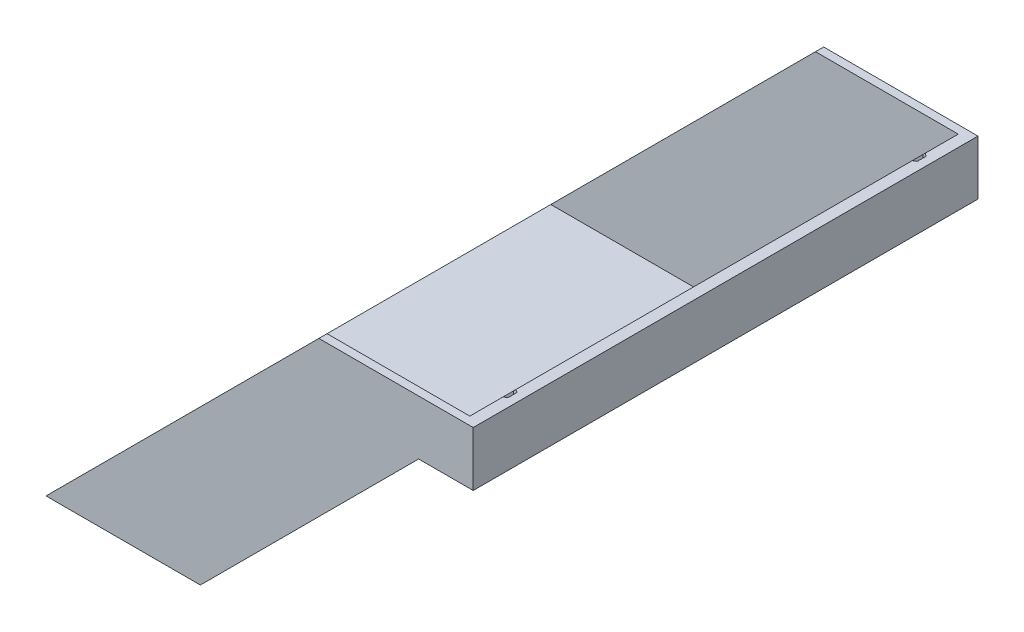
ISO-10303-21;
HEADER;
FILE_DESCRIPTION(('STEP AP214'),'2;1');
FILE_NAME('part.step','',(''),(''),'','','');
FILE_SCHEMA(('AUTOMOTIVE_DESIGN { 1 0 10303 214 1 1 1 1 }'));
ENDSEC;
DATA;
#1=APPLICATION_CONTEXT('core data for automotive mechanical design processes');
#2=APPLICATION_PROTOCOL_DEFINITION('international standard','automotive_design',2000,#1);
#3=PRODUCT_CONTEXT('',#1,'mechanical');
#4=PRODUCT('Part','Part','',(#3));
#5=PRODUCT_RELATED_PRODUCT_CATEGORY('part','',(#4));
#6=PRODUCT_DEFINITION_FORMATION('','',#4);
#7=PRODUCT_DEFINITION_CONTEXT('part definition',#1,'design');
#8=PRODUCT_DEFINITION('design','',#6,#7);
#9=PRODUCT_DEFINITION_SHAPE('','',#8);
#10=(LENGTH_UNIT() NAMED_UNIT(*) SI_UNIT(.MILLI.,.METRE.));
#11=(NAMED_UNIT(*) PLANE_ANGLE_UNIT() SI_UNIT($,.RADIAN.));
#12=(NAMED_UNIT(*) SI_UNIT($,.STERADIAN.) SOLID_ANGLE_UNIT());
#13=UNCERTAINTY_MEASURE_WITH_UNIT(LENGTH_MEASURE(1.E-05),#10,'distance_accuracy_value','');
#14=(GEOMETRIC_REPRESENTATION_CONTEXT(3) GLOBAL_UNCERTAINTY_ASSIGNED_CONTEXT((#13)) GLOBAL_UNIT_ASSIGNED_CONTEXT((#10,
#11,#12)) REPRESENTATION_CONTEXT('',''));
#15=CARTESIAN_POINT('',(0.,0.,0.));
#16=DIRECTION('',(0.,0.,1.));
#17=DIRECTION('',(1.,0.,0.));
#18=AXIS2_PLACEMENT_3D('',#15,#16,#17);
#19=CARTESIAN_POINT('',(-5.99999999999999,0.001000000000001,17.5));
#20=DIRECTION('',(0.,-1.,0.));
#21=DIRECTION('',(1.,0.,0.));
#22=AXIS2_PLACEMENT_3D('',#19,#20,#21);
#23=CYLINDRICAL_SURFACE('',#22,1.5);
#24=CARTESIAN_POINT('',(-6.,-20.,17.5));
#25=DIRECTION('',(0.,-1.,0.));
#26=DIRECTION('',(1.,0.,0.));
#27=AXIS2_PLACEMENT_3D('',#24,#25,#26);
#28=CIRCLE('',#27,1.5);
#29=CARTESIAN_POINT('',(-4.5,-20.,17.5));
#30=VERTEX_POINT('',#29);
#31=EDGE_CURVE('E297',#30,#30,#28,.T.);
#32=ORIENTED_EDGE('',*,*,#31,.T.);
#33=EDGE_LOOP('',(#32));
#34=FACE_BOUND('',#33,.T.);
#35=CARTESIAN_POINT('',(-5.99999999999999,-5.,17.5));
#36=DIRECTION('',(0.,1.,0.));
#37=DIRECTION('',(-1.,0.,0.));
#38=AXIS2_PLACEMENT_3D('',#35,#36,#37);
#39=CIRCLE('',#38,1.5);
#40=CARTESIAN_POINT('',(-7.49999999999999,-5.,17.5));
#41=VERTEX_POINT('',#40);
#42=EDGE_CURVE('E300',#41,#41,#39,.F.);
#43=ORIENTED_EDGE('',*,*,#42,.F.);
#44=EDGE_LOOP('',(#43));
#45=FACE_BOUND('',#44,.T.);
#46=ADVANCED_FACE('F39',(#34,#45),#23,.F.);
#47=CARTESIAN_POINT('',(-5.99999999999999,0.001000000000001,167.5));
#48=DIRECTION('',(0.,-1.,0.));
#49=DIRECTION('',(1.,0.,0.));
#50=AXIS2_PLACEMENT_3D('',#47,#48,#49);
#51=CYLINDRICAL_SURFACE('',#50,1.5);
#52=CARTESIAN_POINT('',(-5.99999999999999,-20.,167.5));
#53=DIRECTION('',(0.,-1.,0.));
#54=DIRECTION('',(1.,0.,0.));
#55=AXIS2_PLACEMENT_3D('',#52,#53,#54);
#56=CIRCLE('',#55,1.5);
#57=CARTESIAN_POINT('',(-4.49999999999999,-20.,167.5));
#58=VERTEX_POINT('',#57);
#59=EDGE_CURVE('E293',#58,#58,#56,.T.);
#60=ORIENTED_EDGE('',*,*,#59,.T.);
#61=EDGE_LOOP('',(#60));
#62=FACE_BOUND('',#61,.T.);
#63=CARTESIAN_POINT('',(-5.99999999999999,-5.,167.5));
#64=DIRECTION('',(0.,1.,0.));
#65=DIRECTION('',(-1.,0.,0.));
#66=AXIS2_PLACEMENT_3D('',#63,#64,#65);
#67=CIRCLE('',#66,1.5);
#68=CARTESIAN_POINT('',(-7.49999999999999,-5.,167.5));
#69=VERTEX_POINT('',#68);
#70=EDGE_CURVE('E242',#69,#69,#67,.F.);
#71=ORIENTED_EDGE('',*,*,#70,.F.);
#72=EDGE_LOOP('',(#71));
#73=FACE_BOUND('',#72,.T.);
#74=ADVANCED_FACE('F488',(#62,#73),#51,.F.);
#75=CARTESIAN_POINT('',(0.,0.,185.));
#76=DIRECTION('',(0.,-1.,0.));
#77=DIRECTION('',(1.,0.,0.));
#78=AXIS2_PLACEMENT_3D('',#75,#76,#77);
#79=PLANE('',#78);
#80=DIRECTION('',(0.,0.,-1.));
#81=VECTOR('',#80,1.);
#82=CARTESIAN_POINT('',(-3.09999999999999,0.,19.1743157806499));
#83=LINE('',#82,#81);
#84=CARTESIAN_POINT('',(-3.09999999999999,0.,19.1743157806499));
#85=VERTEX_POINT('',#84);
#86=CARTESIAN_POINT('',(-3.09999999999999,0.,15.8256842193501));
#87=VERTEX_POINT('',#86);
#88=EDGE_CURVE('E227',#85,#87,#83,.T.);
#89=ORIENTED_EDGE('',*,*,#88,.F.);
#90=DIRECTION('',(0.866025403784438,0.,-0.5));
#91=VECTOR('',#90,1.);
#92=CARTESIAN_POINT('',(-6.,0.,20.8486315612998));
#93=LINE('',#92,#91);
#94=CARTESIAN_POINT('',(-4.24264068711931,0.,19.8340196889453));
#95=VERTEX_POINT('',#94);
#96=EDGE_CURVE('E207',#95,#85,#93,.T.);
#97=ORIENTED_EDGE('',*,*,#96,.F.);
#98=DIRECTION('',(0.,0.,-1.));
#99=VECTOR('',#98,1.);
#100=CARTESIAN_POINT('',(-4.24264068711931,0.,185.));
#101=LINE('',#100,#99);
#102=CARTESIAN_POINT('',(-4.24264068711931,0.,165.165980311055));
#103=VERTEX_POINT('',#102);
#104=EDGE_CURVE('E343',#103,#95,#101,.T.);
#105=ORIENTED_EDGE('',*,*,#104,.F.);
#106=DIRECTION('',(-0.866025403784437,0.,-0.500000000000002));
#107=VECTOR('',#106,1.);
#108=CARTESIAN_POINT('',(-3.09999999999999,0.,165.82568421935));
#109=LINE('',#108,#107);
#110=CARTESIAN_POINT('',(-3.09999999999999,0.,165.82568421935));
#111=VERTEX_POINT('',#110);
#112=EDGE_CURVE('E62',#111,#103,#109,.T.);
#113=ORIENTED_EDGE('',*,*,#112,.F.);
#114=DIRECTION('',(0.,0.,-1.));
#115=VECTOR('',#114,1.);
#116=CARTESIAN_POINT('',(-3.09999999999999,0.,169.17431578065));
#117=LINE('',#116,#115);
#118=CARTESIAN_POINT('',(-3.09999999999999,0.,169.17431578065));
#119=VERTEX_POINT('',#118);
#120=EDGE_CURVE('E272',#119,#111,#117,.T.);
#121=ORIENTED_EDGE('',*,*,#120,.F.);
#122=DIRECTION('',(0.866025403784437,0.,-0.500000000000002));
#123=VECTOR('',#122,1.);
#124=CARTESIAN_POINT('',(-6.00000000000002,0.,170.8486315613));
#125=LINE('',#124,#123);
#126=CARTESIAN_POINT('',(-4.24264068711931,0.,169.834019688945));
#127=VERTEX_POINT('',#126);
#128=EDGE_CURVE('E238',#127,#119,#125,.T.);
#129=ORIENTED_EDGE('',*,*,#128,.F.);
#130=CARTESIAN_POINT('',(-4.24264068711931,0.,182.));
#131=VERTEX_POINT('',#130);
#132=EDGE_CURVE('E324',#131,#127,#101,.T.);
#133=ORIENTED_EDGE('',*,*,#132,.F.);
#134=DIRECTION('',(-1.,0.,0.));
#135=VECTOR('',#134,1.);
#136=CARTESIAN_POINT('',(0.,0.,182.));
#137=LINE('',#136,#135);
#138=CARTESIAN_POINT('',(-56.5685424949241,0.,182.));
#139=VERTEX_POINT('',#138);
#140=EDGE_CURVE('E331',#131,#139,#137,.T.);
#141=ORIENTED_EDGE('',*,*,#140,.T.);
#142=DIRECTION('',(0.,0.,-1.));
#143=VECTOR('',#142,1.);
#144=CARTESIAN_POINT('',(-56.5685424949241,0.,185.));
#145=LINE('',#144,#143);
#146=CARTESIAN_POINT('',(-56.5685424949241,0.,185.));
#147=VERTEX_POINT('',#146);
#148=EDGE_CURVE('E374',#147,#139,#145,.T.);
#149=ORIENTED_EDGE('',*,*,#148,.F.);
#150=DIRECTION('',(-1.,0.,0.));
#151=VECTOR('',#150,1.);
#152=CARTESIAN_POINT('',(0.,0.,185.));
#153=LINE('',#152,#151);
#154=CARTESIAN_POINT('',(0.,0.,185.));
#155=VERTEX_POINT('',#154);
#156=EDGE_CURVE('E346',#155,#147,#153,.T.);
#157=ORIENTED_EDGE('',*,*,#156,.F.);
#158=DIRECTION('',(0.,0.,-1.));
#159=VECTOR('',#158,1.);
#160=CARTESIAN_POINT('',(0.,0.,185.));
#161=LINE('',#160,#159);
#162=CARTESIAN_POINT('',(0.,0.,0.));
#163=VERTEX_POINT('',#162);
#164=EDGE_CURVE('E357',#155,#163,#161,.T.);
#165=ORIENTED_EDGE('',*,*,#164,.T.);
#166=DIRECTION('',(-1.,0.,0.));
#167=VECTOR('',#166,1.);
#168=CARTESIAN_POINT('',(0.,0.,0.));
#169=LINE('',#168,#167);
#170=CARTESIAN_POINT('',(-56.5685424949241,0.,0.));
#171=VERTEX_POINT('',#170);
#172=EDGE_CURVE('E336',#163,#171,#169,.T.);
#173=ORIENTED_EDGE('',*,*,#172,.T.);
#174=CARTESIAN_POINT('',(-56.5685424949241,0.,3.));
#175=VERTEX_POINT('',#174);
#176=EDGE_CURVE('E373',#175,#171,#145,.T.);
#177=ORIENTED_EDGE('',*,*,#176,.F.);
#178=DIRECTION('',(-1.,0.,0.));
#179=VECTOR('',#178,1.);
#180=CARTESIAN_POINT('',(0.,0.,3.));
#181=LINE('',#180,#179);
#182=CARTESIAN_POINT('',(-4.24264068711931,0.,3.));
#183=VERTEX_POINT('',#182);
#184=EDGE_CURVE('E315',#183,#175,#181,.T.);
#185=ORIENTED_EDGE('',*,*,#184,.F.);
#186=CARTESIAN_POINT('',(-4.24264068711931,0.,15.1659803110547));
#187=VERTEX_POINT('',#186);
#188=EDGE_CURVE('E333',#187,#183,#101,.T.);
#189=ORIENTED_EDGE('',*,*,#188,.F.);
#190=DIRECTION('',(-0.866025403784439,0.,-0.5));
#191=VECTOR('',#190,1.);
#192=CARTESIAN_POINT('',(-3.09999999999999,0.,15.8256842193501));
#193=LINE('',#192,#191);
#194=EDGE_CURVE('E54',#87,#187,#193,.T.);
#195=ORIENTED_EDGE('',*,*,#194,.F.);
#196=EDGE_LOOP('',(#89,#97,#105,#113,#121,#129,#133,#141,#149,#157,#165,#173,#177,#185,#189,#195));
#197=FACE_BOUND('',#196,.T.);
#198=ADVANCED_FACE('F41',(#197),#79,.F.);
#199=CARTESIAN_POINT('',(-56.5685424949241,0.,185.));
#200=DIRECTION('',(0.707106781186544,-0.707106781186551,0.));
#201=DIRECTION('',(0.707106781186551,0.707106781186544,0.));
#202=AXIS2_PLACEMENT_3D('',#199,#200,#201);
#203=PLANE('',#202);
#204=DIRECTION('',(-0.707106781186551,-0.707106781186544,0.));
#205=VECTOR('',#204,1.);
#206=CARTESIAN_POINT('',(-56.5685424949241,0.,3.));
#207=LINE('',#206,#205);
#208=CARTESIAN_POINT('',(-153.568542494925,-97.,3.));
#209=VERTEX_POINT('',#208);
#210=EDGE_CURVE('E319',#175,#209,#207,.T.);
#211=ORIENTED_EDGE('',*,*,#210,.F.);
#212=ORIENTED_EDGE('',*,*,#176,.T.);
#213=DIRECTION('',(-0.707106781186551,-0.707106781186544,0.));
#214=VECTOR('',#213,1.);
#215=CARTESIAN_POINT('',(-56.5685424949241,0.,0.));
#216=LINE('',#215,#214);
#217=CARTESIAN_POINT('',(-156.568542494925,-100.,0.));
#218=VERTEX_POINT('',#217);
#219=EDGE_CURVE('E360',#171,#218,#216,.T.);
#220=ORIENTED_EDGE('',*,*,#219,.T.);
#221=DIRECTION('',(0.,0.,-1.));
#222=VECTOR('',#221,1.);
#223=CARTESIAN_POINT('',(-156.568542494925,-100.,185.));
#224=LINE('',#223,#222);
#225=CARTESIAN_POINT('',(-156.568542494925,-100.,185.));
#226=VERTEX_POINT('',#225);
#227=EDGE_CURVE('E370',#226,#218,#224,.T.);
#228=ORIENTED_EDGE('',*,*,#227,.F.);
#229=DIRECTION('',(-0.707106781186551,-0.707106781186544,0.));
#230=VECTOR('',#229,1.);
#231=CARTESIAN_POINT('',(-56.5685424949241,0.,185.));
#232=LINE('',#231,#230);
#233=EDGE_CURVE('E349',#147,#226,#232,.T.);
#234=ORIENTED_EDGE('',*,*,#233,.F.);
#235=ORIENTED_EDGE('',*,*,#148,.T.);
#236=DIRECTION('',(-0.707106781186551,-0.707106781186544,0.));
#237=VECTOR('',#236,1.);
#238=CARTESIAN_POINT('',(-56.5685424949241,0.,182.));
#239=LINE('',#238,#237);
#240=CARTESIAN_POINT('',(-153.568542494925,-97.,182.));
#241=VERTEX_POINT('',#240);
#242=EDGE_CURVE('E328',#139,#241,#239,.T.);
#243=ORIENTED_EDGE('',*,*,#242,.T.);
#244=DIRECTION('',(0.,0.,-1.));
#245=VECTOR('',#244,1.);
#246=CARTESIAN_POINT('',(-153.568542494925,-97.,185.));
#247=LINE('',#246,#245);
#248=EDGE_CURVE('E323',#241,#209,#247,.T.);
#249=ORIENTED_EDGE('',*,*,#248,.T.);
#250=EDGE_LOOP('',(#211,#212,#220,#228,#234,#235,#243,#249));
#251=FACE_BOUND('',#250,.T.);
#252=ADVANCED_FACE('F419',(#251),#203,.F.);
#253=CARTESIAN_POINT('',(-156.568542494925,-100.,185.));
#254=DIRECTION('',(0.,1.,0.));
#255=DIRECTION('',(-1.,0.,0.));
#256=AXIS2_PLACEMENT_3D('',#253,#254,#255);
#257=PLANE('',#256);
#258=DIRECTION('',(1.,0.,0.));
#259=VECTOR('',#258,1.);
#260=CARTESIAN_POINT('',(-156.568542494925,-100.,0.));
#261=LINE('',#260,#259);
#262=CARTESIAN_POINT('',(-100.000000000001,-100.,0.));
#263=VERTEX_POINT('',#262);
#264=EDGE_CURVE('E362',#218,#263,#261,.T.);
#265=ORIENTED_EDGE('',*,*,#264,.T.);
#266=DIRECTION('',(0.,0.,-1.));
#267=VECTOR('',#266,1.);
#268=CARTESIAN_POINT('',(-100.000000000001,-100.,185.));
#269=LINE('',#268,#267);
#270=CARTESIAN_POINT('',(-100.000000000001,-100.,185.));
#271=VERTEX_POINT('',#270);
#272=EDGE_CURVE('E367',#271,#263,#269,.T.);
#273=ORIENTED_EDGE('',*,*,#272,.F.);
#274=DIRECTION('',(1.,0.,0.));
#275=VECTOR('',#274,1.);
#276=CARTESIAN_POINT('',(-156.568542494925,-100.,185.));
#277=LINE('',#276,#275);
#278=EDGE_CURVE('E352',#226,#271,#277,.T.);
#279=ORIENTED_EDGE('',*,*,#278,.F.);
#280=ORIENTED_EDGE('',*,*,#227,.T.);
#281=EDGE_LOOP('',(#265,#273,#279,#280));
#282=FACE_BOUND('',#281,.T.);
#283=ADVANCED_FACE('F427',(#282),#257,.F.);
#284=CARTESIAN_POINT('',(0.,0.,185.));
#285=DIRECTION('',(-0.707106781186544,0.707106781186551,0.));
#286=DIRECTION('',(-0.707106781186551,-0.707106781186544,0.));
#287=AXIS2_PLACEMENT_3D('',#284,#285,#286);
#288=PLANE('',#287);
#289=DIRECTION('',(0.707106781186551,0.707106781186544,0.));
#290=VECTOR('',#289,1.);
#291=CARTESIAN_POINT('',(0.,0.,0.));
#292=LINE('',#291,#290);
#293=CARTESIAN_POINT('',(-20.0000000000002,-20.,0.));
#294=VERTEX_POINT('',#293);
#295=EDGE_CURVE('E350',#263,#294,#292,.T.);
#296=ORIENTED_EDGE('',*,*,#295,.T.);
#297=DIRECTION('',(0.,0.,1.));
#298=VECTOR('',#297,1.);
#299=CARTESIAN_POINT('',(-20.000000000001,-20.,-28.2842712474626));
#300=LINE('',#299,#298);
#301=CARTESIAN_POINT('',(-20.0000000000002,-20.,185.));
#302=VERTEX_POINT('',#301);
#303=EDGE_CURVE('E310',#294,#302,#300,.T.);
#304=ORIENTED_EDGE('',*,*,#303,.T.);
#305=DIRECTION('',(0.707106781186551,0.707106781186544,0.));
#306=VECTOR('',#305,1.);
#307=CARTESIAN_POINT('',(0.,0.,185.));
#308=LINE('',#307,#306);
#309=EDGE_CURVE('E354',#271,#302,#308,.T.);
#310=ORIENTED_EDGE('',*,*,#309,.F.);
#311=ORIENTED_EDGE('',*,*,#272,.T.);
#312=EDGE_LOOP('',(#296,#304,#310,#311));
#313=FACE_BOUND('',#312,.T.);
#314=ADVANCED_FACE('F431',(#313),#288,.F.);
#315=CARTESIAN_POINT('',(0.,0.,185.));
#316=DIRECTION('',(0.,0.,1.));
#317=DIRECTION('',(1.,0.,0.));
#318=AXIS2_PLACEMENT_3D('',#315,#316,#317);
#319=PLANE('',#318);
#320=ORIENTED_EDGE('',*,*,#156,.T.);
#321=ORIENTED_EDGE('',*,*,#233,.T.);
#322=ORIENTED_EDGE('',*,*,#278,.T.);
#323=ORIENTED_EDGE('',*,*,#309,.T.);
#324=DIRECTION('',(1.,0.,0.));
#325=VECTOR('',#324,1.);
#326=CARTESIAN_POINT('',(0.,-20.,185.));
#327=LINE('',#326,#325);
#328=CARTESIAN_POINT('',(0.,-20.,185.));
#329=VERTEX_POINT('',#328);
#330=EDGE_CURVE('E296',#302,#329,#327,.T.);
#331=ORIENTED_EDGE('',*,*,#330,.T.);
#332=DIRECTION('',(0.,1.,0.));
#333=VECTOR('',#332,1.);
#334=CARTESIAN_POINT('',(0.,0.,185.));
#335=LINE('',#334,#333);
#336=EDGE_CURVE('E307',#329,#155,#335,.T.);
#337=ORIENTED_EDGE('',*,*,#336,.T.);
#338=EDGE_LOOP('',(#320,#321,#322,#323,#331,#337));
#339=FACE_BOUND('',#338,.T.);
#340=ADVANCED_FACE('F435',(#339),#319,.T.);
#341=CARTESIAN_POINT('',(0.,0.,0.));
#342=DIRECTION('',(0.,0.,1.));
#343=DIRECTION('',(1.,0.,0.));
#344=AXIS2_PLACEMENT_3D('',#341,#342,#343);
#345=PLANE('',#344);
#346=ORIENTED_EDGE('',*,*,#172,.F.);
#347=DIRECTION('',(0.,-1.,0.));
#348=VECTOR('',#347,1.);
#349=CARTESIAN_POINT('',(0.,0.,0.));
#350=LINE('',#349,#348);
#351=CARTESIAN_POINT('',(0.,-20.,0.));
#352=VERTEX_POINT('',#351);
#353=EDGE_CURVE('E301',#163,#352,#350,.T.);
#354=ORIENTED_EDGE('',*,*,#353,.T.);
#355=DIRECTION('',(-1.,0.,0.));
#356=VECTOR('',#355,1.);
#357=CARTESIAN_POINT('',(0.,-20.,0.));
#358=LINE('',#357,#356);
#359=EDGE_CURVE('E303',#352,#294,#358,.T.);
#360=ORIENTED_EDGE('',*,*,#359,.T.);
#361=ORIENTED_EDGE('',*,*,#295,.F.);
#362=ORIENTED_EDGE('',*,*,#264,.F.);
#363=ORIENTED_EDGE('',*,*,#219,.F.);
#364=EDGE_LOOP('',(#346,#354,#360,#361,#362,#363));
#365=FACE_BOUND('',#364,.T.);
#366=ADVANCED_FACE('F423',(#365),#345,.F.);
#367=CARTESIAN_POINT('',(-156.568542494925,-97.,185.));
#368=DIRECTION('',(0.,1.,0.));
#369=DIRECTION('',(-1.,0.,0.));
#370=AXIS2_PLACEMENT_3D('',#367,#368,#369);
#371=PLANE('',#370);
#372=DIRECTION('',(1.,0.,0.));
#373=VECTOR('',#372,1.);
#374=CARTESIAN_POINT('',(-156.568542494925,-97.,3.));
#375=LINE('',#374,#373);
#376=CARTESIAN_POINT('',(-101.24264068712,-97.,3.));
#377=VERTEX_POINT('',#376);
#378=EDGE_CURVE('E316',#209,#377,#375,.T.);
#379=ORIENTED_EDGE('',*,*,#378,.F.);
#380=ORIENTED_EDGE('',*,*,#248,.F.);
#381=DIRECTION('',(1.,0.,0.));
#382=VECTOR('',#381,1.);
#383=CARTESIAN_POINT('',(-156.568542494925,-97.,182.));
#384=LINE('',#383,#382);
#385=CARTESIAN_POINT('',(-101.24264068712,-97.,182.));
#386=VERTEX_POINT('',#385);
#387=EDGE_CURVE('E325',#241,#386,#384,.T.);
#388=ORIENTED_EDGE('',*,*,#387,.T.);
#389=DIRECTION('',(0.,0.,-1.));
#390=VECTOR('',#389,1.);
#391=CARTESIAN_POINT('',(-101.24264068712,-97.,185.));
#392=LINE('',#391,#390);
#393=EDGE_CURVE('E320',#386,#377,#392,.T.);
#394=ORIENTED_EDGE('',*,*,#393,.T.);
#395=EDGE_LOOP('',(#379,#380,#388,#394));
#396=FACE_BOUND('',#395,.T.);
#397=ADVANCED_FACE('F453',(#396),#371,.T.);
#398=CARTESIAN_POINT('',(-2.12132034355963,2.12132034355965,185.));
#399=DIRECTION('',(-0.707106781186544,0.707106781186551,0.));
#400=DIRECTION('',(-0.707106781186551,-0.707106781186544,0.));
#401=AXIS2_PLACEMENT_3D('',#398,#399,#400);
#402=PLANE('',#401);
#403=DIRECTION('',(0.65465367070798,0.654653670707973,-0.377964473009229));
#404=VECTOR('',#403,1.);
#405=CARTESIAN_POINT('',(-43.2923474755925,-39.0497067884728,42.3793784150463));
#406=LINE('',#405,#404);
#407=CARTESIAN_POINT('',(-5.99999999999998,-1.75735931288063,20.8486315612998));
#408=VERTEX_POINT('',#407);
#409=EDGE_CURVE('E11',#408,#95,#406,.T.);
#410=ORIENTED_EDGE('',*,*,#409,.F.);
#411=DIRECTION('',(0.65465367070798,0.654653670707973,0.377964473009229));
#412=VECTOR('',#411,1.);
#413=CARTESIAN_POINT('',(37.9415126009188,42.1841532880377,46.2182756900397));
#414=LINE('',#413,#412);
#415=CARTESIAN_POINT('',(-8.89999999999999,-4.65735931288064,19.1743157806499));
#416=VERTEX_POINT('',#415);
#417=EDGE_CURVE('E47',#416,#408,#414,.T.);
#418=ORIENTED_EDGE('',*,*,#417,.F.);
#419=DIRECTION('',(0.,0.,1.));
#420=VECTOR('',#419,1.);
#421=CARTESIAN_POINT('',(-8.89999999999999,-4.65735931288064,185.));
#422=LINE('',#421,#420);
#423=CARTESIAN_POINT('',(-8.89999999999998,-4.65735931288063,15.8256842193501));
#424=VERTEX_POINT('',#423);
#425=EDGE_CURVE('E395',#424,#416,#422,.T.);
#426=ORIENTED_EDGE('',*,*,#425,.F.);
#427=DIRECTION('',(-0.65465367070798,-0.654653670707973,0.377964473009229));
#428=VECTOR('',#427,1.);
#429=CARTESIAN_POINT('',(-44.9494903327353,-40.7068496456156,36.6388671671037));
#430=LINE('',#429,#428);
#431=CARTESIAN_POINT('',(-6.00000000000001,-1.7573593128807,14.1513684387002));
#432=VERTEX_POINT('',#431);
#433=EDGE_CURVE('E393',#432,#424,#430,.T.);
#434=ORIENTED_EDGE('',*,*,#433,.F.);
#435=DIRECTION('',(-0.65465367070798,-0.654653670707973,-0.377964473009229));
#436=VECTOR('',#435,1.);
#437=CARTESIAN_POINT('',(39.5986554580617,43.8412961451805,40.4777644420971));
#438=LINE('',#437,#436);
#439=EDGE_CURVE('E391',#187,#432,#438,.T.);
#440=ORIENTED_EDGE('',*,*,#439,.F.);
#441=ORIENTED_EDGE('',*,*,#188,.T.);
#442=DIRECTION('',(0.707106781186551,0.707106781186544,0.));
#443=VECTOR('',#442,1.);
#444=CARTESIAN_POINT('',(-2.12132034355963,2.12132034355965,3.));
#445=LINE('',#444,#443);
#446=EDGE_CURVE('E318',#377,#183,#445,.T.);
#447=ORIENTED_EDGE('',*,*,#446,.F.);
#448=ORIENTED_EDGE('',*,*,#393,.F.);
#449=DIRECTION('',(0.707106781186551,0.707106781186544,0.));
#450=VECTOR('',#449,1.);
#451=CARTESIAN_POINT('',(-2.12132034355963,2.12132034355965,182.));
#452=LINE('',#451,#450);
#453=EDGE_CURVE('E327',#386,#131,#452,.T.);
#454=ORIENTED_EDGE('',*,*,#453,.T.);
#455=ORIENTED_EDGE('',*,*,#132,.T.);
#456=DIRECTION('',(0.65465367070798,0.654653670707973,-0.377964473009231));
#457=VECTOR('',#456,1.);
#458=CARTESIAN_POINT('',(-6.17697302768765,-1.93433234056832,170.950806986475));
#459=LINE('',#458,#457);
#460=CARTESIAN_POINT('',(-6.00000000000002,-1.7573593128807,170.8486315613));
#461=VERTEX_POINT('',#460);
#462=EDGE_CURVE('E389',#461,#127,#459,.T.);
#463=ORIENTED_EDGE('',*,*,#462,.F.);
#464=DIRECTION('',(0.654653670707981,0.654653670707975,0.377964473009224));
#465=VECTOR('',#464,1.);
#466=CARTESIAN_POINT('',(0.826138153013941,5.0687788401332,174.789704261468));
#467=LINE('',#466,#465);
#468=CARTESIAN_POINT('',(-8.90000000000002,-4.65735931288066,169.17431578065));
#469=VERTEX_POINT('',#468);
#470=EDGE_CURVE('E387',#469,#461,#467,.T.);
#471=ORIENTED_EDGE('',*,*,#470,.F.);
#472=DIRECTION('',(0.,0.,1.));
#473=VECTOR('',#472,1.);
#474=CARTESIAN_POINT('',(-8.90000000000002,-4.65735931288066,185.));
#475=LINE('',#474,#473);
#476=CARTESIAN_POINT('',(-8.90000000000002,-4.65735931288066,165.82568421935));
#477=VERTEX_POINT('',#476);
#478=EDGE_CURVE('E385',#477,#469,#475,.T.);
#479=ORIENTED_EDGE('',*,*,#478,.F.);
#480=DIRECTION('',(-0.65465367070798,-0.654653670707973,0.377964473009229));
#481=VECTOR('',#480,1.);
#482=CARTESIAN_POINT('',(-7.83411588483051,-3.59147519771117,165.210295738532));
#483=LINE('',#482,#481);
#484=CARTESIAN_POINT('',(-5.99999999999997,-1.75735931288065,164.1513684387));
#485=VERTEX_POINT('',#484);
#486=EDGE_CURVE('E383',#485,#477,#483,.T.);
#487=ORIENTED_EDGE('',*,*,#486,.F.);
#488=DIRECTION('',(-0.654653670707979,-0.654653670707973,-0.377964473009231));
#489=VECTOR('',#488,1.);
#490=CARTESIAN_POINT('',(2.48328101015687,6.7259216972761,169.049193013525));
#491=LINE('',#490,#489);
#492=EDGE_CURVE('E377',#103,#485,#491,.T.);
#493=ORIENTED_EDGE('',*,*,#492,.F.);
#494=ORIENTED_EDGE('',*,*,#104,.T.);
#495=EDGE_LOOP('',(#410,#418,#426,#434,#440,#441,#447,#448,#454,#455,#463,#471,#479,#487,#493,#494));
#496=FACE_BOUND('',#495,.T.);
#497=ADVANCED_FACE('F403',(#496),#402,.T.);
#498=CARTESIAN_POINT('',(0.,0.,182.));
#499=DIRECTION('',(0.,0.,1.));
#500=DIRECTION('',(1.,0.,0.));
#501=AXIS2_PLACEMENT_3D('',#498,#499,#500);
#502=PLANE('',#501);
#503=ORIENTED_EDGE('',*,*,#140,.F.);
#504=ORIENTED_EDGE('',*,*,#453,.F.);
#505=ORIENTED_EDGE('',*,*,#387,.F.);
#506=ORIENTED_EDGE('',*,*,#242,.F.);
#507=EDGE_LOOP('',(#503,#504,#505,#506));
#508=FACE_BOUND('',#507,.T.);
#509=ADVANCED_FACE('F450',(#508),#502,.F.);
#510=CARTESIAN_POINT('',(0.,0.,3.));
#511=DIRECTION('',(0.,0.,1.));
#512=DIRECTION('',(1.,0.,0.));
#513=AXIS2_PLACEMENT_3D('',#510,#511,#512);
#514=PLANE('',#513);
#515=ORIENTED_EDGE('',*,*,#184,.T.);
#516=ORIENTED_EDGE('',*,*,#210,.T.);
#517=ORIENTED_EDGE('',*,*,#378,.T.);
#518=ORIENTED_EDGE('',*,*,#446,.T.);
#519=EDGE_LOOP('',(#515,#516,#517,#518));
#520=FACE_BOUND('',#519,.T.);
#521=ADVANCED_FACE('F413',(#520),#514,.T.);
#522=CARTESIAN_POINT('',(0.,0.,-28.2842712474626));
#523=DIRECTION('',(1.,0.,0.));
#524=DIRECTION('',(0.,1.,0.));
#525=AXIS2_PLACEMENT_3D('',#522,#523,#524);
#526=PLANE('',#525);
#527=ORIENTED_EDGE('',*,*,#353,.F.);
#528=ORIENTED_EDGE('',*,*,#164,.F.);
#529=ORIENTED_EDGE('',*,*,#336,.F.);
#530=DIRECTION('',(0.,0.,1.));
#531=VECTOR('',#530,1.);
#532=CARTESIAN_POINT('',(0.,-20.,-28.2842712474626));
#533=LINE('',#532,#531);
#534=EDGE_CURVE('E304',#352,#329,#533,.T.);
#535=ORIENTED_EDGE('',*,*,#534,.F.);
#536=EDGE_LOOP('',(#527,#528,#529,#535));
#537=FACE_BOUND('',#536,.T.);
#538=ADVANCED_FACE('F443',(#537),#526,.T.);
#539=CARTESIAN_POINT('',(0.,-20.,-28.2842712474626));
#540=DIRECTION('',(0.,-1.,0.));
#541=DIRECTION('',(1.,0.,0.));
#542=AXIS2_PLACEMENT_3D('',#539,#540,#541);
#543=PLANE('',#542);
#544=ORIENTED_EDGE('',*,*,#59,.F.);
#545=EDGE_LOOP('',(#544));
#546=FACE_BOUND('',#545,.T.);
#547=ORIENTED_EDGE('',*,*,#31,.F.);
#548=EDGE_LOOP('',(#547));
#549=FACE_BOUND('',#548,.T.);
#550=ORIENTED_EDGE('',*,*,#359,.F.);
#551=ORIENTED_EDGE('',*,*,#534,.T.);
#552=ORIENTED_EDGE('',*,*,#330,.F.);
#553=ORIENTED_EDGE('',*,*,#303,.F.);
#554=EDGE_LOOP('',(#550,#551,#552,#553));
#555=FACE_BOUND('',#554,.T.);
#556=ADVANCED_FACE('F439',(#546,#549,#555),#543,.T.);
#557=CARTESIAN_POINT('',(0.,-5.,0.));
#558=DIRECTION('',(0.,1.,0.));
#559=DIRECTION('',(-1.,0.,0.));
#560=AXIS2_PLACEMENT_3D('',#557,#558,#559);
#561=PLANE('',#560);
#562=DIRECTION('',(0.866025403784437,0.,-0.500000000000002));
#563=VECTOR('',#562,1.);
#564=CARTESIAN_POINT('',(-6.00000000000002,-5.,170.8486315613));
#565=LINE('',#564,#563);
#566=CARTESIAN_POINT('',(-6.00000000000002,-5.,170.8486315613));
#567=VERTEX_POINT('',#566);
#568=CARTESIAN_POINT('',(-3.09999999999999,-5.,169.17431578065));
#569=VERTEX_POINT('',#568);
#570=EDGE_CURVE('E273',#567,#569,#565,.T.);
#571=ORIENTED_EDGE('',*,*,#570,.T.);
#572=DIRECTION('',(0.,0.,-1.));
#573=VECTOR('',#572,1.);
#574=CARTESIAN_POINT('',(-3.09999999999999,-5.,169.17431578065));
#575=LINE('',#574,#573);
#576=CARTESIAN_POINT('',(-3.09999999999999,-5.,165.82568421935));
#577=VERTEX_POINT('',#576);
#578=EDGE_CURVE('E288',#569,#577,#575,.T.);
#579=ORIENTED_EDGE('',*,*,#578,.T.);
#580=DIRECTION('',(-0.866025403784437,0.,-0.500000000000002));
#581=VECTOR('',#580,1.);
#582=CARTESIAN_POINT('',(-3.09999999999999,-5.,165.82568421935));
#583=LINE('',#582,#581);
#584=CARTESIAN_POINT('',(-5.99999999999997,-5.,164.1513684387));
#585=VERTEX_POINT('',#584);
#586=EDGE_CURVE('E285',#577,#585,#583,.T.);
#587=ORIENTED_EDGE('',*,*,#586,.T.);
#588=DIRECTION('',(-0.866025403784438,0.,0.5));
#589=VECTOR('',#588,1.);
#590=CARTESIAN_POINT('',(-5.99999999999997,-5.,164.1513684387));
#591=LINE('',#590,#589);
#592=CARTESIAN_POINT('',(-8.90000000000002,-5.,165.82568421935));
#593=VERTEX_POINT('',#592);
#594=EDGE_CURVE('E282',#585,#593,#591,.T.);
#595=ORIENTED_EDGE('',*,*,#594,.T.);
#596=DIRECTION('',(0.,0.,1.));
#597=VECTOR('',#596,1.);
#598=CARTESIAN_POINT('',(-8.90000000000002,-5.,165.82568421935));
#599=LINE('',#598,#597);
#600=CARTESIAN_POINT('',(-8.90000000000002,-5.,169.17431578065));
#601=VERTEX_POINT('',#600);
#602=EDGE_CURVE('E279',#593,#601,#599,.T.);
#603=ORIENTED_EDGE('',*,*,#602,.T.);
#604=DIRECTION('',(0.866025403784442,0.,0.499999999999995));
#605=VECTOR('',#604,1.);
#606=CARTESIAN_POINT('',(-8.90000000000002,-5.,169.17431578065));
#607=LINE('',#606,#605);
#608=EDGE_CURVE('E256',#601,#567,#607,.T.);
#609=ORIENTED_EDGE('',*,*,#608,.T.);
#610=EDGE_LOOP('',(#571,#579,#587,#595,#603,#609));
#611=FACE_BOUND('',#610,.T.);
#612=ORIENTED_EDGE('',*,*,#70,.T.);
#613=EDGE_LOOP('',(#612));
#614=FACE_BOUND('',#613,.T.);
#615=ADVANCED_FACE('F466',(#611,#614),#561,.T.);
#616=CARTESIAN_POINT('',(-6.00000000000002,-5.,170.8486315613));
#617=DIRECTION('',(0.500000000000002,0.,0.866025403784438));
#618=DIRECTION('',(0.866025403784438,0.,-0.500000000000002));
#619=AXIS2_PLACEMENT_3D('',#616,#617,#618);
#620=PLANE('',#619);
#621=ORIENTED_EDGE('',*,*,#462,.T.);
#622=ORIENTED_EDGE('',*,*,#128,.T.);
#623=DIRECTION('',(0.,1.,0.));
#624=VECTOR('',#623,1.);
#625=CARTESIAN_POINT('',(-3.09999999999999,-5.,169.17431578065));
#626=LINE('',#625,#624);
#627=EDGE_CURVE('E253',#569,#119,#626,.T.);
#628=ORIENTED_EDGE('',*,*,#627,.F.);
#629=ORIENTED_EDGE('',*,*,#570,.F.);
#630=DIRECTION('',(0.,1.,0.));
#631=VECTOR('',#630,1.);
#632=CARTESIAN_POINT('',(-6.00000000000002,-5.,170.8486315613));
#633=LINE('',#632,#631);
#634=EDGE_CURVE('E268',#567,#461,#633,.T.);
#635=ORIENTED_EDGE('',*,*,#634,.T.);
#636=EDGE_LOOP('',(#621,#622,#628,#629,#635));
#637=FACE_BOUND('',#636,.T.);
#638=ADVANCED_FACE('F459',(#637),#620,.F.);
#639=CARTESIAN_POINT('',(-8.90000000000002,-5.,169.17431578065));
#640=DIRECTION('',(-0.499999999999995,0.,0.866025403784442));
#641=DIRECTION('',(0.866025403784442,0.,0.499999999999995));
#642=AXIS2_PLACEMENT_3D('',#639,#640,#641);
#643=PLANE('',#642);
#644=ORIENTED_EDGE('',*,*,#470,.T.);
#645=ORIENTED_EDGE('',*,*,#634,.F.);
#646=ORIENTED_EDGE('',*,*,#608,.F.);
#647=DIRECTION('',(0.,1.,0.));
#648=VECTOR('',#647,1.);
#649=CARTESIAN_POINT('',(-8.90000000000002,-5.,169.17431578065));
#650=LINE('',#649,#648);
#651=EDGE_CURVE('E265',#601,#469,#650,.T.);
#652=ORIENTED_EDGE('',*,*,#651,.T.);
#653=EDGE_LOOP('',(#644,#645,#646,#652));
#654=FACE_BOUND('',#653,.T.);
#655=ADVANCED_FACE('F470',(#654),#643,.F.);
#656=CARTESIAN_POINT('',(-8.90000000000002,-5.,165.82568421935));
#657=DIRECTION('',(-1.,0.,0.));
#658=DIRECTION('',(0.,-1.,0.));
#659=AXIS2_PLACEMENT_3D('',#656,#657,#658);
#660=PLANE('',#659);
#661=ORIENTED_EDGE('',*,*,#478,.T.);
#662=ORIENTED_EDGE('',*,*,#651,.F.);
#663=ORIENTED_EDGE('',*,*,#602,.F.);
#664=DIRECTION('',(0.,1.,0.));
#665=VECTOR('',#664,1.);
#666=CARTESIAN_POINT('',(-8.90000000000002,-5.,165.82568421935));
#667=LINE('',#666,#665);
#668=EDGE_CURVE('E262',#593,#477,#667,.T.);
#669=ORIENTED_EDGE('',*,*,#668,.T.);
#670=EDGE_LOOP('',(#661,#662,#663,#669));
#671=FACE_BOUND('',#670,.T.);
#672=ADVANCED_FACE('F473',(#671),#660,.F.);
#673=CARTESIAN_POINT('',(-5.99999999999997,-5.,164.1513684387));
#674=DIRECTION('',(-0.5,0.,-0.866025403784438));
#675=DIRECTION('',(-0.866025403784438,0.,0.5));
#676=AXIS2_PLACEMENT_3D('',#673,#674,#675);
#677=PLANE('',#676);
#678=ORIENTED_EDGE('',*,*,#486,.T.);
#679=ORIENTED_EDGE('',*,*,#668,.F.);
#680=ORIENTED_EDGE('',*,*,#594,.F.);
#681=DIRECTION('',(0.,1.,0.));
#682=VECTOR('',#681,1.);
#683=CARTESIAN_POINT('',(-5.99999999999997,-5.,164.1513684387));
#684=LINE('',#683,#682);
#685=EDGE_CURVE('E259',#585,#485,#684,.T.);
#686=ORIENTED_EDGE('',*,*,#685,.T.);
#687=EDGE_LOOP('',(#678,#679,#680,#686));
#688=FACE_BOUND('',#687,.T.);
#689=ADVANCED_FACE('F477',(#688),#677,.F.);
#690=CARTESIAN_POINT('',(-3.09999999999999,-5.,165.82568421935));
#691=DIRECTION('',(0.500000000000002,0.,-0.866025403784437));
#692=DIRECTION('',(-0.866025403784437,0.,-0.500000000000002));
#693=AXIS2_PLACEMENT_3D('',#690,#691,#692);
#694=PLANE('',#693);
#695=ORIENTED_EDGE('',*,*,#492,.T.);
#696=ORIENTED_EDGE('',*,*,#685,.F.);
#697=ORIENTED_EDGE('',*,*,#586,.F.);
#698=DIRECTION('',(0.,1.,0.));
#699=VECTOR('',#698,1.);
#700=CARTESIAN_POINT('',(-3.09999999999999,-5.,165.82568421935));
#701=LINE('',#700,#699);
#702=EDGE_CURVE('E257',#577,#111,#701,.T.);
#703=ORIENTED_EDGE('',*,*,#702,.T.);
#704=ORIENTED_EDGE('',*,*,#112,.T.);
#705=EDGE_LOOP('',(#695,#696,#697,#703,#704));
#706=FACE_BOUND('',#705,.T.);
#707=ADVANCED_FACE('F478',(#706),#694,.F.);
#708=CARTESIAN_POINT('',(-3.09999999999999,-5.,169.17431578065));
#709=DIRECTION('',(1.,0.,0.));
#710=DIRECTION('',(0.,1.,0.));
#711=AXIS2_PLACEMENT_3D('',#708,#709,#710);
#712=PLANE('',#711);
#713=ORIENTED_EDGE('',*,*,#120,.T.);
#714=ORIENTED_EDGE('',*,*,#702,.F.);
#715=ORIENTED_EDGE('',*,*,#578,.F.);
#716=ORIENTED_EDGE('',*,*,#627,.T.);
#717=EDGE_LOOP('',(#713,#714,#715,#716));
#718=FACE_BOUND('',#717,.T.);
#719=ADVANCED_FACE('F463',(#718),#712,.F.);
#720=CARTESIAN_POINT('',(0.,-5.,0.));
#721=DIRECTION('',(0.,1.,0.));
#722=DIRECTION('',(-1.,0.,0.));
#723=AXIS2_PLACEMENT_3D('',#720,#721,#722);
#724=PLANE('',#723);
#725=DIRECTION('',(0.866025403784438,0.,-0.5));
#726=VECTOR('',#725,1.);
#727=CARTESIAN_POINT('',(-6.,-5.,20.8486315612998));
#728=LINE('',#727,#726);
#729=CARTESIAN_POINT('',(-6.,-5.,20.8486315612998));
#730=VERTEX_POINT('',#729);
#731=CARTESIAN_POINT('',(-3.09999999999999,-5.,19.1743157806499));
#732=VERTEX_POINT('',#731);
#733=EDGE_CURVE('E204',#730,#732,#728,.T.);
#734=ORIENTED_EDGE('',*,*,#733,.T.);
#735=DIRECTION('',(0.,0.,-1.));
#736=VECTOR('',#735,1.);
#737=CARTESIAN_POINT('',(-3.09999999999999,-5.,19.1743157806499));
#738=LINE('',#737,#736);
#739=CARTESIAN_POINT('',(-3.09999999999999,-5.,15.8256842193501));
#740=VERTEX_POINT('',#739);
#741=EDGE_CURVE('E215',#732,#740,#738,.T.);
#742=ORIENTED_EDGE('',*,*,#741,.T.);
#743=DIRECTION('',(-0.866025403784439,0.,-0.5));
#744=VECTOR('',#743,1.);
#745=CARTESIAN_POINT('',(-3.09999999999999,-5.,15.8256842193501));
#746=LINE('',#745,#744);
#747=CARTESIAN_POINT('',(-5.99999999999999,-5.,14.1513684387002));
#748=VERTEX_POINT('',#747);
#749=EDGE_CURVE('E220',#740,#748,#746,.T.);
#750=ORIENTED_EDGE('',*,*,#749,.T.);
#751=DIRECTION('',(-0.866025403784439,0.,0.5));
#752=VECTOR('',#751,1.);
#753=CARTESIAN_POINT('',(-5.99999999999999,-5.,14.1513684387002));
#754=LINE('',#753,#752);
#755=CARTESIAN_POINT('',(-8.89999999999999,-5.,15.8256842193501));
#756=VERTEX_POINT('',#755);
#757=EDGE_CURVE('E231',#748,#756,#754,.T.);
#758=ORIENTED_EDGE('',*,*,#757,.T.);
#759=DIRECTION('',(0.,0.,1.));
#760=VECTOR('',#759,1.);
#761=CARTESIAN_POINT('',(-8.89999999999999,-5.,15.8256842193501));
#762=LINE('',#761,#760);
#763=CARTESIAN_POINT('',(-8.89999999999999,-5.,19.1743157806499));
#764=VERTEX_POINT('',#763);
#765=EDGE_CURVE('E234',#756,#764,#762,.T.);
#766=ORIENTED_EDGE('',*,*,#765,.T.);
#767=DIRECTION('',(0.866025403784439,0.,0.5));
#768=VECTOR('',#767,1.);
#769=CARTESIAN_POINT('',(-8.89999999999999,-5.,19.1743157806499));
#770=LINE('',#769,#768);
#771=EDGE_CURVE('E212',#764,#730,#770,.T.);
#772=ORIENTED_EDGE('',*,*,#771,.T.);
#773=EDGE_LOOP('',(#734,#742,#750,#758,#766,#772));
#774=FACE_BOUND('',#773,.T.);
#775=ORIENTED_EDGE('',*,*,#42,.T.);
#776=EDGE_LOOP('',(#775));
#777=FACE_BOUND('',#776,.T.);
#778=ADVANCED_FACE('F222',(#774,#777),#724,.T.);
#779=CARTESIAN_POINT('',(-6.,-5.,20.8486315612998));
#780=DIRECTION('',(0.5,0.,0.866025403784438));
#781=DIRECTION('',(0.866025403784438,0.,-0.5));
#782=AXIS2_PLACEMENT_3D('',#779,#780,#781);
#783=PLANE('',#782);
#784=ORIENTED_EDGE('',*,*,#409,.T.);
#785=ORIENTED_EDGE('',*,*,#96,.T.);
#786=DIRECTION('',(0.,1.,0.));
#787=VECTOR('',#786,1.);
#788=CARTESIAN_POINT('',(-3.09999999999999,-5.,19.1743157806499));
#789=LINE('',#788,#787);
#790=EDGE_CURVE('E199',#732,#85,#789,.T.);
#791=ORIENTED_EDGE('',*,*,#790,.F.);
#792=ORIENTED_EDGE('',*,*,#733,.F.);
#793=DIRECTION('',(0.,1.,0.));
#794=VECTOR('',#793,1.);
#795=CARTESIAN_POINT('',(-6.,-5.,20.8486315612998));
#796=LINE('',#795,#794);
#797=EDGE_CURVE('E240',#730,#408,#796,.T.);
#798=ORIENTED_EDGE('',*,*,#797,.T.);
#799=EDGE_LOOP('',(#784,#785,#791,#792,#798));
#800=FACE_BOUND('',#799,.T.);
#801=ADVANCED_FACE('F201',(#800),#783,.F.);
#802=CARTESIAN_POINT('',(-8.89999999999999,-5.,19.1743157806499));
#803=DIRECTION('',(-0.5,0.,0.866025403784438));
#804=DIRECTION('',(0.866025403784439,0.,0.5));
#805=AXIS2_PLACEMENT_3D('',#802,#803,#804);
#806=PLANE('',#805);
#807=ORIENTED_EDGE('',*,*,#417,.T.);
#808=ORIENTED_EDGE('',*,*,#797,.F.);
#809=ORIENTED_EDGE('',*,*,#771,.F.);
#810=DIRECTION('',(0.,1.,0.));
#811=VECTOR('',#810,1.);
#812=CARTESIAN_POINT('',(-8.89999999999999,-5.,19.1743157806499));
#813=LINE('',#812,#811);
#814=EDGE_CURVE('E243',#764,#416,#813,.T.);
#815=ORIENTED_EDGE('',*,*,#814,.T.);
#816=EDGE_LOOP('',(#807,#808,#809,#815));
#817=FACE_BOUND('',#816,.T.);
#818=ADVANCED_FACE('F398',(#817),#806,.F.);
#819=CARTESIAN_POINT('',(-8.89999999999999,-5.,15.8256842193501));
#820=DIRECTION('',(-1.,0.,0.));
#821=DIRECTION('',(0.,-1.,0.));
#822=AXIS2_PLACEMENT_3D('',#819,#820,#821);
#823=PLANE('',#822);
#824=ORIENTED_EDGE('',*,*,#425,.T.);
#825=ORIENTED_EDGE('',*,*,#814,.F.);
#826=ORIENTED_EDGE('',*,*,#765,.F.);
#827=DIRECTION('',(0.,1.,0.));
#828=VECTOR('',#827,1.);
#829=CARTESIAN_POINT('',(-8.89999999999999,-5.,15.8256842193501));
#830=LINE('',#829,#828);
#831=EDGE_CURVE('E246',#756,#424,#830,.T.);
#832=ORIENTED_EDGE('',*,*,#831,.T.);
#833=EDGE_LOOP('',(#824,#825,#826,#832));
#834=FACE_BOUND('',#833,.T.);
#835=ADVANCED_FACE('F603',(#834),#823,.F.);
#836=CARTESIAN_POINT('',(-5.99999999999999,-5.,14.1513684387002));
#837=DIRECTION('',(-0.5,0.,-0.866025403784439));
#838=DIRECTION('',(-0.866025403784439,0.,0.5));
#839=AXIS2_PLACEMENT_3D('',#836,#837,#838);
#840=PLANE('',#839);
#841=ORIENTED_EDGE('',*,*,#433,.T.);
#842=ORIENTED_EDGE('',*,*,#831,.F.);
#843=ORIENTED_EDGE('',*,*,#757,.F.);
#844=DIRECTION('',(0.,1.,0.));
#845=VECTOR('',#844,1.);
#846=CARTESIAN_POINT('',(-5.99999999999999,-5.,14.1513684387002));
#847=LINE('',#846,#845);
#848=EDGE_CURVE('E249',#748,#432,#847,.T.);
#849=ORIENTED_EDGE('',*,*,#848,.T.);
#850=EDGE_LOOP('',(#841,#842,#843,#849));
#851=FACE_BOUND('',#850,.T.);
#852=ADVANCED_FACE('F612',(#851),#840,.F.);
#853=CARTESIAN_POINT('',(-3.09999999999999,-5.,15.8256842193501));
#854=DIRECTION('',(0.5,0.,-0.866025403784439));
#855=DIRECTION('',(-0.866025403784439,0.,-0.5));
#856=AXIS2_PLACEMENT_3D('',#853,#854,#855);
#857=PLANE('',#856);
#858=ORIENTED_EDGE('',*,*,#439,.T.);
#859=ORIENTED_EDGE('',*,*,#848,.F.);
#860=ORIENTED_EDGE('',*,*,#749,.F.);
#861=DIRECTION('',(0.,1.,0.));
#862=VECTOR('',#861,1.);
#863=CARTESIAN_POINT('',(-3.09999999999999,-5.,15.8256842193501));
#864=LINE('',#863,#862);
#865=EDGE_CURVE('E211',#740,#87,#864,.T.);
#866=ORIENTED_EDGE('',*,*,#865,.T.);
#867=ORIENTED_EDGE('',*,*,#194,.T.);
#868=EDGE_LOOP('',(#858,#859,#860,#866,#867));
#869=FACE_BOUND('',#868,.T.);
#870=ADVANCED_FACE('F622',(#869),#857,.F.);
#871=CARTESIAN_POINT('',(-3.09999999999999,-5.,19.1743157806499));
#872=DIRECTION('',(1.,0.,0.));
#873=DIRECTION('',(0.,1.,0.));
#874=AXIS2_PLACEMENT_3D('',#871,#872,#873);
#875=PLANE('',#874);
#876=ORIENTED_EDGE('',*,*,#88,.T.);
#877=ORIENTED_EDGE('',*,*,#865,.F.);
#878=ORIENTED_EDGE('',*,*,#741,.F.);
#879=ORIENTED_EDGE('',*,*,#790,.T.);
#880=EDGE_LOOP('',(#876,#877,#878,#879));
#881=FACE_BOUND('',#880,.T.);
#882=ADVANCED_FACE('F216',(#881),#875,.F.);
#883=CLOSED_SHELL('',(#46,#74,#198,#252,#283,#314,#340,#366,#397,#497,#509,#521,#538,#556,#615,
#638,#655,#672,#689,#707,#719,#778,#801,#818,#835,#852,#870,#882));
#884=MANIFOLD_SOLID_BREP('B2',#883);
#885=ADVANCED_BREP_SHAPE_REPRESENTATION('',(#18,#884),#14);
#886=SHAPE_DEFINITION_REPRESENTATION(#9,#885);
ENDSEC;
END-ISO-10303-21;
